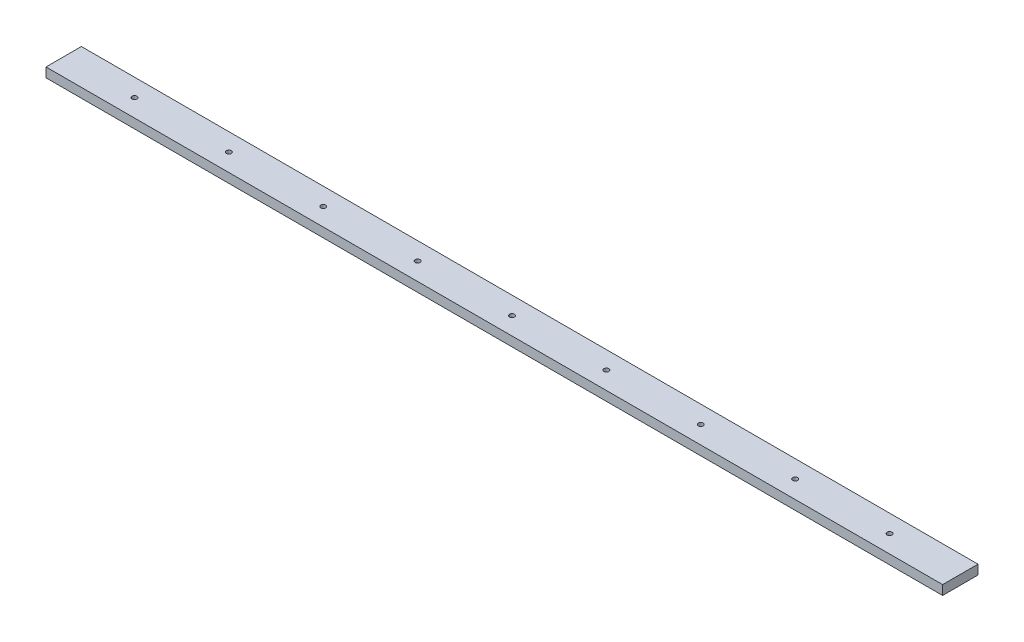
ISO-10303-21;
HEADER;
FILE_DESCRIPTION(('STEP AP214'),'2;1');
FILE_NAME('part.step','',(''),(''),'','','');
FILE_SCHEMA(('AUTOMOTIVE_DESIGN { 1 0 10303 214 1 1 1 1 }'));
ENDSEC;
DATA;
#1=APPLICATION_CONTEXT('core data for automotive mechanical design processes');
#2=APPLICATION_PROTOCOL_DEFINITION('international standard','automotive_design',2000,#1);
#3=PRODUCT_CONTEXT('',#1,'mechanical');
#4=PRODUCT('Part','Part','',(#3));
#5=PRODUCT_RELATED_PRODUCT_CATEGORY('part','',(#4));
#6=PRODUCT_DEFINITION_FORMATION('','',#4);
#7=PRODUCT_DEFINITION_CONTEXT('part definition',#1,'design');
#8=PRODUCT_DEFINITION('design','',#6,#7);
#9=PRODUCT_DEFINITION_SHAPE('','',#8);
#10=(LENGTH_UNIT() NAMED_UNIT(*) SI_UNIT(.MILLI.,.METRE.));
#11=(NAMED_UNIT(*) PLANE_ANGLE_UNIT() SI_UNIT($,.RADIAN.));
#12=(NAMED_UNIT(*) SI_UNIT($,.STERADIAN.) SOLID_ANGLE_UNIT());
#13=UNCERTAINTY_MEASURE_WITH_UNIT(LENGTH_MEASURE(1.E-05),#10,'distance_accuracy_value','');
#14=(GEOMETRIC_REPRESENTATION_CONTEXT(3) GLOBAL_UNCERTAINTY_ASSIGNED_CONTEXT((#13)) GLOBAL_UNIT_ASSIGNED_CONTEXT((#10,
#11,#12)) REPRESENTATION_CONTEXT('',''));
#15=CARTESIAN_POINT('',(0.,0.,0.));
#16=DIRECTION('',(0.,0.,1.));
#17=DIRECTION('',(1.,0.,0.));
#18=AXIS2_PLACEMENT_3D('',#15,#16,#17);
#19=CARTESIAN_POINT('',(380.,8.,-15.));
#20=DIRECTION('',(-1.,0.,0.));
#21=DIRECTION('',(0.,0.,1.));
#22=AXIS2_PLACEMENT_3D('',#19,#20,#21);
#23=PLANE('',#22);
#24=DIRECTION('',(0.,0.,-1.));
#25=VECTOR('',#24,1.);
#26=CARTESIAN_POINT('',(380.,0.,-15.));
#27=LINE('',#26,#25);
#28=CARTESIAN_POINT('',(380.,0.,15.));
#29=VERTEX_POINT('',#28);
#30=CARTESIAN_POINT('',(380.,0.,-15.));
#31=VERTEX_POINT('',#30);
#32=EDGE_CURVE('E111',#29,#31,#27,.T.);
#33=ORIENTED_EDGE('',*,*,#32,.T.);
#34=DIRECTION('',(0.,-1.,0.));
#35=VECTOR('',#34,1.);
#36=CARTESIAN_POINT('',(380.,8.,-15.));
#37=LINE('',#36,#35);
#38=CARTESIAN_POINT('',(380.,8.,-15.));
#39=VERTEX_POINT('',#38);
#40=EDGE_CURVE('E11',#39,#31,#37,.T.);
#41=ORIENTED_EDGE('',*,*,#40,.F.);
#42=DIRECTION('',(0.,0.,-1.));
#43=VECTOR('',#42,1.);
#44=CARTESIAN_POINT('',(380.,8.,-15.));
#45=LINE('',#44,#43);
#46=CARTESIAN_POINT('',(380.,8.,15.));
#47=VERTEX_POINT('',#46);
#48=EDGE_CURVE('E95',#47,#39,#45,.T.);
#49=ORIENTED_EDGE('',*,*,#48,.F.);
#50=DIRECTION('',(0.,-1.,0.));
#51=VECTOR('',#50,1.);
#52=CARTESIAN_POINT('',(380.,8.,15.));
#53=LINE('',#52,#51);
#54=EDGE_CURVE('E107',#47,#29,#53,.T.);
#55=ORIENTED_EDGE('',*,*,#54,.T.);
#56=EDGE_LOOP('',(#33,#41,#49,#55));
#57=FACE_BOUND('',#56,.T.);
#58=ADVANCED_FACE('F43',(#57),#23,.F.);
#59=CARTESIAN_POINT('',(-380.,8.,-15.));
#60=DIRECTION('',(0.,0.,1.));
#61=DIRECTION('',(1.,0.,0.));
#62=AXIS2_PLACEMENT_3D('',#59,#60,#61);
#63=PLANE('',#62);
#64=DIRECTION('',(-1.,0.,0.));
#65=VECTOR('',#64,1.);
#66=CARTESIAN_POINT('',(-380.,0.,-15.));
#67=LINE('',#66,#65);
#68=CARTESIAN_POINT('',(-380.,0.,-15.));
#69=VERTEX_POINT('',#68);
#70=EDGE_CURVE('E100',#31,#69,#67,.T.);
#71=ORIENTED_EDGE('',*,*,#70,.T.);
#72=DIRECTION('',(0.,-1.,0.));
#73=VECTOR('',#72,1.);
#74=CARTESIAN_POINT('',(-380.,8.,-15.));
#75=LINE('',#74,#73);
#76=CARTESIAN_POINT('',(-380.,8.,-15.));
#77=VERTEX_POINT('',#76);
#78=EDGE_CURVE('E52',#77,#69,#75,.T.);
#79=ORIENTED_EDGE('',*,*,#78,.F.);
#80=DIRECTION('',(-1.,0.,0.));
#81=VECTOR('',#80,1.);
#82=CARTESIAN_POINT('',(-380.,8.,-15.));
#83=LINE('',#82,#81);
#84=EDGE_CURVE('E90',#39,#77,#83,.T.);
#85=ORIENTED_EDGE('',*,*,#84,.F.);
#86=ORIENTED_EDGE('',*,*,#40,.T.);
#87=EDGE_LOOP('',(#71,#79,#85,#86));
#88=FACE_BOUND('',#87,.T.);
#89=ADVANCED_FACE('F99',(#88),#63,.F.);
#90=CARTESIAN_POINT('',(-380.,8.,-15.));
#91=DIRECTION('',(1.,0.,0.));
#92=DIRECTION('',(0.,0.,-1.));
#93=AXIS2_PLACEMENT_3D('',#90,#91,#92);
#94=PLANE('',#93);
#95=DIRECTION('',(0.,0.,1.));
#96=VECTOR('',#95,1.);
#97=CARTESIAN_POINT('',(-380.,0.,-15.));
#98=LINE('',#97,#96);
#99=CARTESIAN_POINT('',(-380.,0.,15.));
#100=VERTEX_POINT('',#99);
#101=EDGE_CURVE('E77',#69,#100,#98,.T.);
#102=ORIENTED_EDGE('',*,*,#101,.T.);
#103=DIRECTION('',(0.,-1.,0.));
#104=VECTOR('',#103,1.);
#105=CARTESIAN_POINT('',(-380.,8.,15.));
#106=LINE('',#105,#104);
#107=CARTESIAN_POINT('',(-380.,8.,15.));
#108=VERTEX_POINT('',#107);
#109=EDGE_CURVE('E102',#108,#100,#106,.T.);
#110=ORIENTED_EDGE('',*,*,#109,.F.);
#111=DIRECTION('',(0.,0.,1.));
#112=VECTOR('',#111,1.);
#113=CARTESIAN_POINT('',(-380.,8.,-15.));
#114=LINE('',#113,#112);
#115=EDGE_CURVE('E93',#77,#108,#114,.T.);
#116=ORIENTED_EDGE('',*,*,#115,.F.);
#117=ORIENTED_EDGE('',*,*,#78,.T.);
#118=EDGE_LOOP('',(#102,#110,#116,#117));
#119=FACE_BOUND('',#118,.T.);
#120=ADVANCED_FACE('F103',(#119),#94,.F.);
#121=CARTESIAN_POINT('',(-380.,8.,15.));
#122=DIRECTION('',(0.,0.,-1.));
#123=DIRECTION('',(-1.,0.,0.));
#124=AXIS2_PLACEMENT_3D('',#121,#122,#123);
#125=PLANE('',#124);
#126=DIRECTION('',(1.,0.,0.));
#127=VECTOR('',#126,1.);
#128=CARTESIAN_POINT('',(-380.,0.,15.));
#129=LINE('',#128,#127);
#130=EDGE_CURVE('E83',#100,#29,#129,.T.);
#131=ORIENTED_EDGE('',*,*,#130,.T.);
#132=ORIENTED_EDGE('',*,*,#54,.F.);
#133=DIRECTION('',(1.,0.,0.));
#134=VECTOR('',#133,1.);
#135=CARTESIAN_POINT('',(-380.,8.,15.));
#136=LINE('',#135,#134);
#137=EDGE_CURVE('E60',#108,#47,#136,.T.);
#138=ORIENTED_EDGE('',*,*,#137,.F.);
#139=ORIENTED_EDGE('',*,*,#109,.T.);
#140=EDGE_LOOP('',(#131,#132,#138,#139));
#141=FACE_BOUND('',#140,.T.);
#142=ADVANCED_FACE('F125',(#141),#125,.F.);
#143=CARTESIAN_POINT('',(0.,8.,0.));
#144=DIRECTION('',(0.,1.,0.));
#145=DIRECTION('',(0.,0.,1.));
#146=AXIS2_PLACEMENT_3D('',#143,#144,#145);
#147=PLANE('',#146);
#148=CARTESIAN_POINT('',(0.,8.,0.));
#149=DIRECTION('',(0.,1.,0.));
#150=DIRECTION('',(0.,0.,1.));
#151=AXIS2_PLACEMENT_3D('',#148,#149,#150);
#152=CIRCLE('',#151,2.1);
#153=CARTESIAN_POINT('',(0.,8.,2.1));
#154=VERTEX_POINT('',#153);
#155=EDGE_CURVE('E199',#154,#154,#152,.T.);
#156=ORIENTED_EDGE('',*,*,#155,.F.);
#157=EDGE_LOOP('',(#156));
#158=FACE_BOUND('',#157,.T.);
#159=CARTESIAN_POINT('',(80.,8.,0.));
#160=DIRECTION('',(0.,1.,0.));
#161=DIRECTION('',(0.,0.,1.));
#162=AXIS2_PLACEMENT_3D('',#159,#160,#161);
#163=CIRCLE('',#162,2.1);
#164=CARTESIAN_POINT('',(80.,8.,2.1));
#165=VERTEX_POINT('',#164);
#166=EDGE_CURVE('E191',#165,#165,#163,.T.);
#167=ORIENTED_EDGE('',*,*,#166,.F.);
#168=EDGE_LOOP('',(#167));
#169=FACE_BOUND('',#168,.T.);
#170=CARTESIAN_POINT('',(160.,8.,0.));
#171=DIRECTION('',(0.,1.,0.));
#172=DIRECTION('',(0.,0.,1.));
#173=AXIS2_PLACEMENT_3D('',#170,#171,#172);
#174=CIRCLE('',#173,2.09999999999999);
#175=CARTESIAN_POINT('',(160.,8.,2.09999999999999));
#176=VERTEX_POINT('',#175);
#177=EDGE_CURVE('E183',#176,#176,#174,.T.);
#178=ORIENTED_EDGE('',*,*,#177,.F.);
#179=EDGE_LOOP('',(#178));
#180=FACE_BOUND('',#179,.T.);
#181=CARTESIAN_POINT('',(240.,8.,0.));
#182=DIRECTION('',(0.,1.,0.));
#183=DIRECTION('',(0.,0.,1.));
#184=AXIS2_PLACEMENT_3D('',#181,#182,#183);
#185=CIRCLE('',#184,2.09999999999999);
#186=CARTESIAN_POINT('',(240.,8.,2.09999999999999));
#187=VERTEX_POINT('',#186);
#188=EDGE_CURVE('E175',#187,#187,#185,.T.);
#189=ORIENTED_EDGE('',*,*,#188,.F.);
#190=EDGE_LOOP('',(#189));
#191=FACE_BOUND('',#190,.T.);
#192=CARTESIAN_POINT('',(320.,8.,0.));
#193=DIRECTION('',(0.,1.,0.));
#194=DIRECTION('',(0.,0.,1.));
#195=AXIS2_PLACEMENT_3D('',#192,#193,#194);
#196=CIRCLE('',#195,2.09999999999999);
#197=CARTESIAN_POINT('',(320.,8.,2.09999999999999));
#198=VERTEX_POINT('',#197);
#199=EDGE_CURVE('E167',#198,#198,#196,.T.);
#200=ORIENTED_EDGE('',*,*,#199,.F.);
#201=EDGE_LOOP('',(#200));
#202=FACE_BOUND('',#201,.T.);
#203=CARTESIAN_POINT('',(-80.,8.,0.));
#204=DIRECTION('',(0.,1.,0.));
#205=DIRECTION('',(0.,0.,1.));
#206=AXIS2_PLACEMENT_3D('',#203,#204,#205);
#207=CIRCLE('',#206,2.1);
#208=CARTESIAN_POINT('',(-80.,8.,2.1));
#209=VERTEX_POINT('',#208);
#210=EDGE_CURVE('E159',#209,#209,#207,.T.);
#211=ORIENTED_EDGE('',*,*,#210,.F.);
#212=EDGE_LOOP('',(#211));
#213=FACE_BOUND('',#212,.T.);
#214=CARTESIAN_POINT('',(-160.,8.,0.));
#215=DIRECTION('',(0.,1.,0.));
#216=DIRECTION('',(0.,0.,1.));
#217=AXIS2_PLACEMENT_3D('',#214,#215,#216);
#218=CIRCLE('',#217,2.09999999999999);
#219=CARTESIAN_POINT('',(-160.,8.,2.09999999999999));
#220=VERTEX_POINT('',#219);
#221=EDGE_CURVE('E151',#220,#220,#218,.T.);
#222=ORIENTED_EDGE('',*,*,#221,.F.);
#223=EDGE_LOOP('',(#222));
#224=FACE_BOUND('',#223,.T.);
#225=CARTESIAN_POINT('',(-240.,8.,0.));
#226=DIRECTION('',(0.,1.,0.));
#227=DIRECTION('',(0.,0.,1.));
#228=AXIS2_PLACEMENT_3D('',#225,#226,#227);
#229=CIRCLE('',#228,2.09999999999999);
#230=CARTESIAN_POINT('',(-240.,8.,2.09999999999999));
#231=VERTEX_POINT('',#230);
#232=EDGE_CURVE('E143',#231,#231,#229,.T.);
#233=ORIENTED_EDGE('',*,*,#232,.F.);
#234=EDGE_LOOP('',(#233));
#235=FACE_BOUND('',#234,.T.);
#236=CARTESIAN_POINT('',(-320.,8.,0.));
#237=DIRECTION('',(0.,1.,0.));
#238=DIRECTION('',(0.,0.,1.));
#239=AXIS2_PLACEMENT_3D('',#236,#237,#238);
#240=CIRCLE('',#239,2.09999999999999);
#241=CARTESIAN_POINT('',(-320.,8.,2.09999999999999));
#242=VERTEX_POINT('',#241);
#243=EDGE_CURVE('E135',#242,#242,#240,.T.);
#244=ORIENTED_EDGE('',*,*,#243,.F.);
#245=EDGE_LOOP('',(#244));
#246=FACE_BOUND('',#245,.T.);
#247=ORIENTED_EDGE('',*,*,#48,.T.);
#248=ORIENTED_EDGE('',*,*,#84,.T.);
#249=ORIENTED_EDGE('',*,*,#115,.T.);
#250=ORIENTED_EDGE('',*,*,#137,.T.);
#251=EDGE_LOOP('',(#247,#248,#249,#250));
#252=FACE_BOUND('',#251,.T.);
#253=ADVANCED_FACE('F91',(#158,#169,#180,#191,#202,#213,#224,#235,#246,#252),#147,.T.);
#254=CARTESIAN_POINT('',(0.,0.,0.));
#255=DIRECTION('',(0.,1.,0.));
#256=DIRECTION('',(0.,0.,1.));
#257=AXIS2_PLACEMENT_3D('',#254,#255,#256);
#258=PLANE('',#257);
#259=CARTESIAN_POINT('',(0.,0.,0.));
#260=DIRECTION('',(0.,1.,0.));
#261=DIRECTION('',(0.,0.,1.));
#262=AXIS2_PLACEMENT_3D('',#259,#260,#261);
#263=CIRCLE('',#262,2.1);
#264=CARTESIAN_POINT('',(0.,0.,2.1));
#265=VERTEX_POINT('',#264);
#266=EDGE_CURVE('E195',#265,#265,#263,.T.);
#267=ORIENTED_EDGE('',*,*,#266,.T.);
#268=EDGE_LOOP('',(#267));
#269=FACE_BOUND('',#268,.T.);
#270=CARTESIAN_POINT('',(80.,0.,0.));
#271=DIRECTION('',(0.,1.,0.));
#272=DIRECTION('',(0.,0.,1.));
#273=AXIS2_PLACEMENT_3D('',#270,#271,#272);
#274=CIRCLE('',#273,2.1);
#275=CARTESIAN_POINT('',(80.,0.,2.1));
#276=VERTEX_POINT('',#275);
#277=EDGE_CURVE('E187',#276,#276,#274,.T.);
#278=ORIENTED_EDGE('',*,*,#277,.T.);
#279=EDGE_LOOP('',(#278));
#280=FACE_BOUND('',#279,.T.);
#281=CARTESIAN_POINT('',(160.,0.,0.));
#282=DIRECTION('',(0.,1.,0.));
#283=DIRECTION('',(0.,0.,1.));
#284=AXIS2_PLACEMENT_3D('',#281,#282,#283);
#285=CIRCLE('',#284,2.09999999999999);
#286=CARTESIAN_POINT('',(160.,0.,2.09999999999999));
#287=VERTEX_POINT('',#286);
#288=EDGE_CURVE('E179',#287,#287,#285,.T.);
#289=ORIENTED_EDGE('',*,*,#288,.T.);
#290=EDGE_LOOP('',(#289));
#291=FACE_BOUND('',#290,.T.);
#292=CARTESIAN_POINT('',(240.,0.,0.));
#293=DIRECTION('',(0.,1.,0.));
#294=DIRECTION('',(0.,0.,1.));
#295=AXIS2_PLACEMENT_3D('',#292,#293,#294);
#296=CIRCLE('',#295,2.09999999999999);
#297=CARTESIAN_POINT('',(240.,0.,2.09999999999999));
#298=VERTEX_POINT('',#297);
#299=EDGE_CURVE('E171',#298,#298,#296,.T.);
#300=ORIENTED_EDGE('',*,*,#299,.T.);
#301=EDGE_LOOP('',(#300));
#302=FACE_BOUND('',#301,.T.);
#303=CARTESIAN_POINT('',(320.,0.,0.));
#304=DIRECTION('',(0.,1.,0.));
#305=DIRECTION('',(0.,0.,1.));
#306=AXIS2_PLACEMENT_3D('',#303,#304,#305);
#307=CIRCLE('',#306,2.09999999999999);
#308=CARTESIAN_POINT('',(320.,0.,2.09999999999999));
#309=VERTEX_POINT('',#308);
#310=EDGE_CURVE('E163',#309,#309,#307,.T.);
#311=ORIENTED_EDGE('',*,*,#310,.T.);
#312=EDGE_LOOP('',(#311));
#313=FACE_BOUND('',#312,.T.);
#314=CARTESIAN_POINT('',(-80.,0.,0.));
#315=DIRECTION('',(0.,1.,0.));
#316=DIRECTION('',(0.,0.,1.));
#317=AXIS2_PLACEMENT_3D('',#314,#315,#316);
#318=CIRCLE('',#317,2.1);
#319=CARTESIAN_POINT('',(-80.,0.,2.1));
#320=VERTEX_POINT('',#319);
#321=EDGE_CURVE('E155',#320,#320,#318,.T.);
#322=ORIENTED_EDGE('',*,*,#321,.T.);
#323=EDGE_LOOP('',(#322));
#324=FACE_BOUND('',#323,.T.);
#325=CARTESIAN_POINT('',(-160.,0.,0.));
#326=DIRECTION('',(0.,1.,0.));
#327=DIRECTION('',(0.,0.,1.));
#328=AXIS2_PLACEMENT_3D('',#325,#326,#327);
#329=CIRCLE('',#328,2.09999999999999);
#330=CARTESIAN_POINT('',(-160.,0.,2.09999999999999));
#331=VERTEX_POINT('',#330);
#332=EDGE_CURVE('E147',#331,#331,#329,.T.);
#333=ORIENTED_EDGE('',*,*,#332,.T.);
#334=EDGE_LOOP('',(#333));
#335=FACE_BOUND('',#334,.T.);
#336=CARTESIAN_POINT('',(-240.,0.,0.));
#337=DIRECTION('',(0.,1.,0.));
#338=DIRECTION('',(0.,0.,1.));
#339=AXIS2_PLACEMENT_3D('',#336,#337,#338);
#340=CIRCLE('',#339,2.09999999999999);
#341=CARTESIAN_POINT('',(-240.,0.,2.09999999999999));
#342=VERTEX_POINT('',#341);
#343=EDGE_CURVE('E139',#342,#342,#340,.T.);
#344=ORIENTED_EDGE('',*,*,#343,.T.);
#345=EDGE_LOOP('',(#344));
#346=FACE_BOUND('',#345,.T.);
#347=CARTESIAN_POINT('',(-320.,0.,0.));
#348=DIRECTION('',(0.,1.,0.));
#349=DIRECTION('',(0.,0.,1.));
#350=AXIS2_PLACEMENT_3D('',#347,#348,#349);
#351=CIRCLE('',#350,2.09999999999999);
#352=CARTESIAN_POINT('',(-320.,0.,2.09999999999999));
#353=VERTEX_POINT('',#352);
#354=EDGE_CURVE('E115',#353,#353,#351,.T.);
#355=ORIENTED_EDGE('',*,*,#354,.T.);
#356=EDGE_LOOP('',(#355));
#357=FACE_BOUND('',#356,.T.);
#358=ORIENTED_EDGE('',*,*,#32,.F.);
#359=ORIENTED_EDGE('',*,*,#130,.F.);
#360=ORIENTED_EDGE('',*,*,#101,.F.);
#361=ORIENTED_EDGE('',*,*,#70,.F.);
#362=EDGE_LOOP('',(#358,#359,#360,#361));
#363=FACE_BOUND('',#362,.T.);
#364=ADVANCED_FACE('F128',(#269,#280,#291,#302,#313,#324,#335,#346,#357,#363),#258,.F.);
#365=CARTESIAN_POINT('',(-320.,8.,0.));
#366=DIRECTION('',(0.,1.,0.));
#367=DIRECTION('',(0.,0.,1.));
#368=AXIS2_PLACEMENT_3D('',#365,#366,#367);
#369=CYLINDRICAL_SURFACE('',#368,2.09999999999999);
#370=ORIENTED_EDGE('',*,*,#354,.F.);
#371=EDGE_LOOP('',(#370));
#372=FACE_BOUND('',#371,.T.);
#373=ORIENTED_EDGE('',*,*,#243,.T.);
#374=EDGE_LOOP('',(#373));
#375=FACE_BOUND('',#374,.T.);
#376=ADVANCED_FACE('F225',(#372,#375),#369,.F.);
#377=CARTESIAN_POINT('',(-240.,8.,0.));
#378=DIRECTION('',(0.,1.,0.));
#379=DIRECTION('',(0.,0.,1.));
#380=AXIS2_PLACEMENT_3D('',#377,#378,#379);
#381=CYLINDRICAL_SURFACE('',#380,2.09999999999999);
#382=ORIENTED_EDGE('',*,*,#343,.F.);
#383=EDGE_LOOP('',(#382));
#384=FACE_BOUND('',#383,.T.);
#385=ORIENTED_EDGE('',*,*,#232,.T.);
#386=EDGE_LOOP('',(#385));
#387=FACE_BOUND('',#386,.T.);
#388=ADVANCED_FACE('F227',(#384,#387),#381,.F.);
#389=CARTESIAN_POINT('',(-160.,8.,0.));
#390=DIRECTION('',(0.,1.,0.));
#391=DIRECTION('',(0.,0.,1.));
#392=AXIS2_PLACEMENT_3D('',#389,#390,#391);
#393=CYLINDRICAL_SURFACE('',#392,2.09999999999999);
#394=ORIENTED_EDGE('',*,*,#332,.F.);
#395=EDGE_LOOP('',(#394));
#396=FACE_BOUND('',#395,.T.);
#397=ORIENTED_EDGE('',*,*,#221,.T.);
#398=EDGE_LOOP('',(#397));
#399=FACE_BOUND('',#398,.T.);
#400=ADVANCED_FACE('F234',(#396,#399),#393,.F.);
#401=CARTESIAN_POINT('',(-80.,8.,0.));
#402=DIRECTION('',(0.,1.,0.));
#403=DIRECTION('',(0.,0.,1.));
#404=AXIS2_PLACEMENT_3D('',#401,#402,#403);
#405=CYLINDRICAL_SURFACE('',#404,2.1);
#406=ORIENTED_EDGE('',*,*,#321,.F.);
#407=EDGE_LOOP('',(#406));
#408=FACE_BOUND('',#407,.T.);
#409=ORIENTED_EDGE('',*,*,#210,.T.);
#410=EDGE_LOOP('',(#409));
#411=FACE_BOUND('',#410,.T.);
#412=ADVANCED_FACE('F292',(#408,#411),#405,.F.);
#413=CARTESIAN_POINT('',(320.,8.,0.));
#414=DIRECTION('',(0.,1.,0.));
#415=DIRECTION('',(0.,0.,1.));
#416=AXIS2_PLACEMENT_3D('',#413,#414,#415);
#417=CYLINDRICAL_SURFACE('',#416,2.09999999999999);
#418=ORIENTED_EDGE('',*,*,#310,.F.);
#419=EDGE_LOOP('',(#418));
#420=FACE_BOUND('',#419,.T.);
#421=ORIENTED_EDGE('',*,*,#199,.T.);
#422=EDGE_LOOP('',(#421));
#423=FACE_BOUND('',#422,.T.);
#424=ADVANCED_FACE('F304',(#420,#423),#417,.F.);
#425=CARTESIAN_POINT('',(240.,8.,0.));
#426=DIRECTION('',(0.,1.,0.));
#427=DIRECTION('',(0.,0.,1.));
#428=AXIS2_PLACEMENT_3D('',#425,#426,#427);
#429=CYLINDRICAL_SURFACE('',#428,2.09999999999999);
#430=ORIENTED_EDGE('',*,*,#299,.F.);
#431=EDGE_LOOP('',(#430));
#432=FACE_BOUND('',#431,.T.);
#433=ORIENTED_EDGE('',*,*,#188,.T.);
#434=EDGE_LOOP('',(#433));
#435=FACE_BOUND('',#434,.T.);
#436=ADVANCED_FACE('F316',(#432,#435),#429,.F.);
#437=CARTESIAN_POINT('',(160.,8.,0.));
#438=DIRECTION('',(0.,1.,0.));
#439=DIRECTION('',(0.,0.,1.));
#440=AXIS2_PLACEMENT_3D('',#437,#438,#439);
#441=CYLINDRICAL_SURFACE('',#440,2.09999999999999);
#442=ORIENTED_EDGE('',*,*,#288,.F.);
#443=EDGE_LOOP('',(#442));
#444=FACE_BOUND('',#443,.T.);
#445=ORIENTED_EDGE('',*,*,#177,.T.);
#446=EDGE_LOOP('',(#445));
#447=FACE_BOUND('',#446,.T.);
#448=ADVANCED_FACE('F328',(#444,#447),#441,.F.);
#449=CARTESIAN_POINT('',(80.,8.,0.));
#450=DIRECTION('',(0.,1.,0.));
#451=DIRECTION('',(0.,0.,1.));
#452=AXIS2_PLACEMENT_3D('',#449,#450,#451);
#453=CYLINDRICAL_SURFACE('',#452,2.1);
#454=ORIENTED_EDGE('',*,*,#277,.F.);
#455=EDGE_LOOP('',(#454));
#456=FACE_BOUND('',#455,.T.);
#457=ORIENTED_EDGE('',*,*,#166,.T.);
#458=EDGE_LOOP('',(#457));
#459=FACE_BOUND('',#458,.T.);
#460=ADVANCED_FACE('F340',(#456,#459),#453,.F.);
#461=CARTESIAN_POINT('',(0.,8.,0.));
#462=DIRECTION('',(0.,1.,0.));
#463=DIRECTION('',(0.,0.,1.));
#464=AXIS2_PLACEMENT_3D('',#461,#462,#463);
#465=CYLINDRICAL_SURFACE('',#464,2.1);
#466=ORIENTED_EDGE('',*,*,#266,.F.);
#467=EDGE_LOOP('',(#466));
#468=FACE_BOUND('',#467,.T.);
#469=ORIENTED_EDGE('',*,*,#155,.T.);
#470=EDGE_LOOP('',(#469));
#471=FACE_BOUND('',#470,.T.);
#472=ADVANCED_FACE('F204',(#468,#471),#465,.F.);
#473=CLOSED_SHELL('',(#58,#89,#120,#142,#253,#364,#376,#388,#400,#412,#424,#436,#448,#460,#472));
#474=MANIFOLD_SOLID_BREP('B2',#473);
#475=ADVANCED_BREP_SHAPE_REPRESENTATION('',(#18,#474),#14);
#476=SHAPE_DEFINITION_REPRESENTATION(#9,#475);
ENDSEC;
END-ISO-10303-21;
